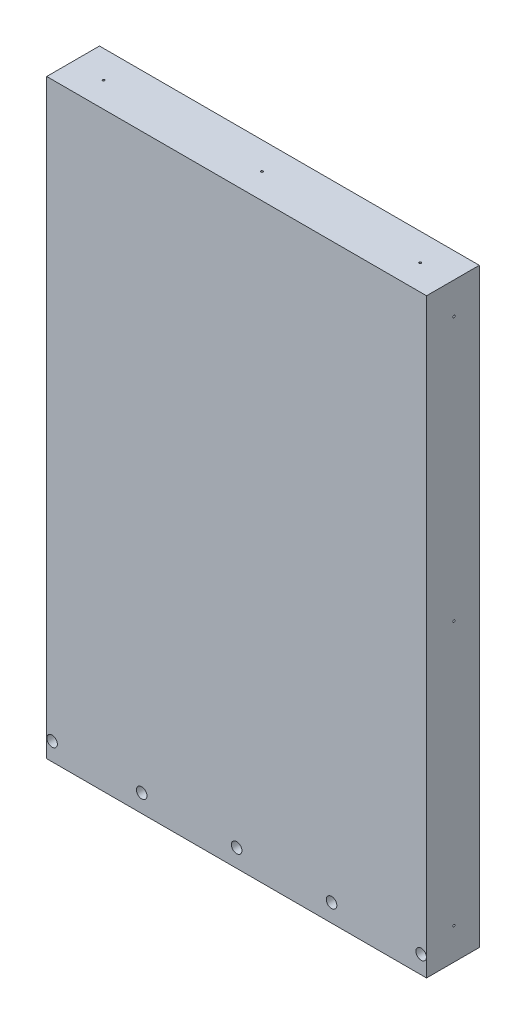
ISO-10303-21;
HEADER;
FILE_DESCRIPTION(('STEP AP214'),'2;1');
FILE_NAME('part.step','',(''),(''),'','','');
FILE_SCHEMA(('AUTOMOTIVE_DESIGN { 1 0 10303 214 1 1 1 1 }'));
ENDSEC;
DATA;
#1=APPLICATION_CONTEXT('core data for automotive mechanical design processes');
#2=APPLICATION_PROTOCOL_DEFINITION('international standard','automotive_design',2000,#1);
#3=PRODUCT_CONTEXT('',#1,'mechanical');
#4=PRODUCT('Part','Part','',(#3));
#5=PRODUCT_RELATED_PRODUCT_CATEGORY('part','',(#4));
#6=PRODUCT_DEFINITION_FORMATION('','',#4);
#7=PRODUCT_DEFINITION_CONTEXT('part definition',#1,'design');
#8=PRODUCT_DEFINITION('design','',#6,#7);
#9=PRODUCT_DEFINITION_SHAPE('','',#8);
#10=(LENGTH_UNIT() NAMED_UNIT(*) SI_UNIT(.MILLI.,.METRE.));
#11=(NAMED_UNIT(*) PLANE_ANGLE_UNIT() SI_UNIT($,.RADIAN.));
#12=(NAMED_UNIT(*) SI_UNIT($,.STERADIAN.) SOLID_ANGLE_UNIT());
#13=UNCERTAINTY_MEASURE_WITH_UNIT(LENGTH_MEASURE(1.E-05),#10,'distance_accuracy_value','');
#14=(GEOMETRIC_REPRESENTATION_CONTEXT(3) GLOBAL_UNCERTAINTY_ASSIGNED_CONTEXT((#13)) GLOBAL_UNIT_ASSIGNED_CONTEXT((#10,
#11,#12)) REPRESENTATION_CONTEXT('',''));
#15=CARTESIAN_POINT('',(0.,0.,0.));
#16=DIRECTION('',(0.,0.,1.));
#17=DIRECTION('',(1.,0.,0.));
#18=AXIS2_PLACEMENT_3D('',#15,#16,#17);
#19=CARTESIAN_POINT('',(0.,0.,25.));
#20=DIRECTION('',(0.,0.,-1.));
#21=DIRECTION('',(-1.,0.,0.));
#22=AXIS2_PLACEMENT_3D('',#19,#20,#21);
#23=PLANE('',#22);
#24=DIRECTION('',(0.,-1.,0.));
#25=VECTOR('',#24,1.);
#26=CARTESIAN_POINT('',(0.,0.,25.));
#27=LINE('',#26,#25);
#28=CARTESIAN_POINT('',(0.,280.,25.));
#29=VERTEX_POINT('',#28);
#30=CARTESIAN_POINT('',(0.,0.,25.));
#31=VERTEX_POINT('',#30);
#32=EDGE_CURVE('E229',#29,#31,#27,.T.);
#33=ORIENTED_EDGE('',*,*,#32,.T.);
#34=DIRECTION('',(1.,0.,0.));
#35=VECTOR('',#34,1.);
#36=CARTESIAN_POINT('',(0.,0.,25.));
#37=LINE('',#36,#35);
#38=CARTESIAN_POINT('',(180.,0.,25.));
#39=VERTEX_POINT('',#38);
#40=EDGE_CURVE('E86',#31,#39,#37,.T.);
#41=ORIENTED_EDGE('',*,*,#40,.T.);
#42=DIRECTION('',(0.,1.,0.));
#43=VECTOR('',#42,1.);
#44=CARTESIAN_POINT('',(180.,0.,25.));
#45=LINE('',#44,#43);
#46=CARTESIAN_POINT('',(180.,280.,25.));
#47=VERTEX_POINT('',#46);
#48=EDGE_CURVE('E232',#39,#47,#45,.T.);
#49=ORIENTED_EDGE('',*,*,#48,.T.);
#50=DIRECTION('',(-1.,0.,0.));
#51=VECTOR('',#50,1.);
#52=CARTESIAN_POINT('',(0.,280.,25.));
#53=LINE('',#52,#51);
#54=EDGE_CURVE('E55',#47,#29,#53,.T.);
#55=ORIENTED_EDGE('',*,*,#54,.T.);
#56=EDGE_LOOP('',(#33,#41,#49,#55));
#57=FACE_BOUND('',#56,.T.);
#58=CARTESIAN_POINT('',(2.55,8.5,25.));
#59=DIRECTION('',(0.,0.,1.));
#60=DIRECTION('',(1.,0.,0.));
#61=AXIS2_PLACEMENT_3D('',#58,#59,#60);
#62=CIRCLE('',#61,2.5);
#63=CARTESIAN_POINT('',(5.05,8.5,25.));
#64=VERTEX_POINT('',#63);
#65=EDGE_CURVE('E223',#64,#64,#62,.T.);
#66=ORIENTED_EDGE('',*,*,#65,.F.);
#67=EDGE_LOOP('',(#66));
#68=FACE_BOUND('',#67,.T.);
#69=CARTESIAN_POINT('',(45.,8.5,25.));
#70=DIRECTION('',(0.,0.,1.));
#71=DIRECTION('',(1.,0.,0.));
#72=AXIS2_PLACEMENT_3D('',#69,#70,#71);
#73=CIRCLE('',#72,2.5);
#74=CARTESIAN_POINT('',(47.5,8.5,25.));
#75=VERTEX_POINT('',#74);
#76=EDGE_CURVE('E217',#75,#75,#73,.T.);
#77=ORIENTED_EDGE('',*,*,#76,.F.);
#78=EDGE_LOOP('',(#77));
#79=FACE_BOUND('',#78,.T.);
#80=CARTESIAN_POINT('',(90.,8.5,25.));
#81=DIRECTION('',(0.,0.,1.));
#82=DIRECTION('',(1.,0.,0.));
#83=AXIS2_PLACEMENT_3D('',#80,#81,#82);
#84=CIRCLE('',#83,2.5);
#85=CARTESIAN_POINT('',(92.5,8.5,25.));
#86=VERTEX_POINT('',#85);
#87=EDGE_CURVE('E211',#86,#86,#84,.T.);
#88=ORIENTED_EDGE('',*,*,#87,.F.);
#89=EDGE_LOOP('',(#88));
#90=FACE_BOUND('',#89,.T.);
#91=CARTESIAN_POINT('',(135.,8.5,25.));
#92=DIRECTION('',(0.,0.,1.));
#93=DIRECTION('',(1.,0.,0.));
#94=AXIS2_PLACEMENT_3D('',#91,#92,#93);
#95=CIRCLE('',#94,2.5);
#96=CARTESIAN_POINT('',(137.5,8.5,25.));
#97=VERTEX_POINT('',#96);
#98=EDGE_CURVE('E205',#97,#97,#95,.T.);
#99=ORIENTED_EDGE('',*,*,#98,.F.);
#100=EDGE_LOOP('',(#99));
#101=FACE_BOUND('',#100,.T.);
#102=CARTESIAN_POINT('',(177.45,8.5,25.));
#103=DIRECTION('',(0.,0.,1.));
#104=DIRECTION('',(1.,0.,0.));
#105=AXIS2_PLACEMENT_3D('',#102,#103,#104);
#106=CIRCLE('',#105,2.5);
#107=CARTESIAN_POINT('',(179.95,8.5,25.));
#108=VERTEX_POINT('',#107);
#109=EDGE_CURVE('E199',#108,#108,#106,.T.);
#110=ORIENTED_EDGE('',*,*,#109,.F.);
#111=EDGE_LOOP('',(#110));
#112=FACE_BOUND('',#111,.T.);
#113=ADVANCED_FACE('F33',(#57,#68,#79,#90,#101,#112),#23,.F.);
#114=CARTESIAN_POINT('',(0.,0.,0.));
#115=DIRECTION('',(0.,0.,-1.));
#116=DIRECTION('',(-1.,0.,0.));
#117=AXIS2_PLACEMENT_3D('',#114,#115,#116);
#118=PLANE('',#117);
#119=CARTESIAN_POINT('',(135.,8.5,0.));
#120=DIRECTION('',(0.,0.,1.));
#121=DIRECTION('',(1.,0.,0.));
#122=AXIS2_PLACEMENT_3D('',#119,#120,#121);
#123=CIRCLE('',#122,2.5);
#124=CARTESIAN_POINT('',(137.5,8.5,0.));
#125=VERTEX_POINT('',#124);
#126=EDGE_CURVE('E202',#125,#125,#123,.T.);
#127=ORIENTED_EDGE('',*,*,#126,.T.);
#128=EDGE_LOOP('',(#127));
#129=FACE_BOUND('',#128,.T.);
#130=CARTESIAN_POINT('',(45.,8.5,0.));
#131=DIRECTION('',(0.,0.,1.));
#132=DIRECTION('',(1.,0.,0.));
#133=AXIS2_PLACEMENT_3D('',#130,#131,#132);
#134=CIRCLE('',#133,2.5);
#135=CARTESIAN_POINT('',(47.5,8.5,0.));
#136=VERTEX_POINT('',#135);
#137=EDGE_CURVE('E214',#136,#136,#134,.T.);
#138=ORIENTED_EDGE('',*,*,#137,.T.);
#139=EDGE_LOOP('',(#138));
#140=FACE_BOUND('',#139,.T.);
#141=DIRECTION('',(0.,-1.,0.));
#142=VECTOR('',#141,1.);
#143=CARTESIAN_POINT('',(0.,0.,0.));
#144=LINE('',#143,#142);
#145=CARTESIAN_POINT('',(0.,280.,0.));
#146=VERTEX_POINT('',#145);
#147=CARTESIAN_POINT('',(0.,0.,0.));
#148=VERTEX_POINT('',#147);
#149=EDGE_CURVE('E226',#146,#148,#144,.T.);
#150=ORIENTED_EDGE('',*,*,#149,.F.);
#151=DIRECTION('',(-1.,0.,0.));
#152=VECTOR('',#151,1.);
#153=CARTESIAN_POINT('',(0.,280.,0.));
#154=LINE('',#153,#152);
#155=CARTESIAN_POINT('',(180.,280.,0.));
#156=VERTEX_POINT('',#155);
#157=EDGE_CURVE('E79',#156,#146,#154,.T.);
#158=ORIENTED_EDGE('',*,*,#157,.F.);
#159=DIRECTION('',(0.,1.,0.));
#160=VECTOR('',#159,1.);
#161=CARTESIAN_POINT('',(180.,0.,0.));
#162=LINE('',#161,#160);
#163=CARTESIAN_POINT('',(180.,0.,0.));
#164=VERTEX_POINT('',#163);
#165=EDGE_CURVE('E73',#164,#156,#162,.T.);
#166=ORIENTED_EDGE('',*,*,#165,.F.);
#167=DIRECTION('',(1.,0.,0.));
#168=VECTOR('',#167,1.);
#169=CARTESIAN_POINT('',(0.,0.,0.));
#170=LINE('',#169,#168);
#171=EDGE_CURVE('E238',#148,#164,#170,.T.);
#172=ORIENTED_EDGE('',*,*,#171,.F.);
#173=EDGE_LOOP('',(#150,#158,#166,#172));
#174=FACE_BOUND('',#173,.T.);
#175=CARTESIAN_POINT('',(2.55,8.5,0.));
#176=DIRECTION('',(0.,0.,1.));
#177=DIRECTION('',(1.,0.,0.));
#178=AXIS2_PLACEMENT_3D('',#175,#176,#177);
#179=CIRCLE('',#178,2.5);
#180=CARTESIAN_POINT('',(5.05,8.5,0.));
#181=VERTEX_POINT('',#180);
#182=EDGE_CURVE('E220',#181,#181,#179,.T.);
#183=ORIENTED_EDGE('',*,*,#182,.T.);
#184=EDGE_LOOP('',(#183));
#185=FACE_BOUND('',#184,.T.);
#186=CARTESIAN_POINT('',(90.,8.5,0.));
#187=DIRECTION('',(0.,0.,1.));
#188=DIRECTION('',(1.,0.,0.));
#189=AXIS2_PLACEMENT_3D('',#186,#187,#188);
#190=CIRCLE('',#189,2.5);
#191=CARTESIAN_POINT('',(92.5,8.5,0.));
#192=VERTEX_POINT('',#191);
#193=EDGE_CURVE('E208',#192,#192,#190,.T.);
#194=ORIENTED_EDGE('',*,*,#193,.T.);
#195=EDGE_LOOP('',(#194));
#196=FACE_BOUND('',#195,.T.);
#197=CARTESIAN_POINT('',(177.45,8.5,0.));
#198=DIRECTION('',(0.,0.,1.));
#199=DIRECTION('',(1.,0.,0.));
#200=AXIS2_PLACEMENT_3D('',#197,#198,#199);
#201=CIRCLE('',#200,2.5);
#202=CARTESIAN_POINT('',(179.95,8.5,0.));
#203=VERTEX_POINT('',#202);
#204=EDGE_CURVE('E198',#203,#203,#201,.T.);
#205=ORIENTED_EDGE('',*,*,#204,.T.);
#206=EDGE_LOOP('',(#205));
#207=FACE_BOUND('',#206,.T.);
#208=ADVANCED_FACE('F249',(#129,#140,#174,#185,#196,#207),#118,.T.);
#209=CARTESIAN_POINT('',(0.,0.,25.));
#210=DIRECTION('',(1.,0.,0.));
#211=DIRECTION('',(0.,0.,-1.));
#212=AXIS2_PLACEMENT_3D('',#209,#210,#211);
#213=PLANE('',#212);
#214=CARTESIAN_POINT('',(0.,265.,12.));
#215=DIRECTION('',(-1.,0.,0.));
#216=DIRECTION('',(0.,0.,1.));
#217=AXIS2_PLACEMENT_3D('',#214,#215,#216);
#218=CIRCLE('',#217,0.5);
#219=CARTESIAN_POINT('',(0.,265.,12.5));
#220=VERTEX_POINT('',#219);
#221=EDGE_CURVE('E180',#220,#220,#218,.T.);
#222=ORIENTED_EDGE('',*,*,#221,.F.);
#223=EDGE_LOOP('',(#222));
#224=FACE_BOUND('',#223,.T.);
#225=CARTESIAN_POINT('',(0.,140.,12.));
#226=DIRECTION('',(-1.,0.,0.));
#227=DIRECTION('',(0.,0.,1.));
#228=AXIS2_PLACEMENT_3D('',#225,#226,#227);
#229=CIRCLE('',#228,0.5);
#230=CARTESIAN_POINT('',(0.,140.,12.5));
#231=VERTEX_POINT('',#230);
#232=EDGE_CURVE('E186',#231,#231,#229,.T.);
#233=ORIENTED_EDGE('',*,*,#232,.F.);
#234=EDGE_LOOP('',(#233));
#235=FACE_BOUND('',#234,.T.);
#236=CARTESIAN_POINT('',(0.,15.,12.));
#237=DIRECTION('',(-1.,0.,0.));
#238=DIRECTION('',(0.,0.,1.));
#239=AXIS2_PLACEMENT_3D('',#236,#237,#238);
#240=CIRCLE('',#239,0.49999999999999);
#241=CARTESIAN_POINT('',(0.,15.,12.5));
#242=VERTEX_POINT('',#241);
#243=EDGE_CURVE('E192',#242,#242,#240,.T.);
#244=ORIENTED_EDGE('',*,*,#243,.F.);
#245=EDGE_LOOP('',(#244));
#246=FACE_BOUND('',#245,.T.);
#247=ORIENTED_EDGE('',*,*,#149,.T.);
#248=DIRECTION('',(0.,0.,-1.));
#249=VECTOR('',#248,1.);
#250=CARTESIAN_POINT('',(0.,0.,25.));
#251=LINE('',#250,#249);
#252=EDGE_CURVE('E11',#31,#148,#251,.T.);
#253=ORIENTED_EDGE('',*,*,#252,.F.);
#254=ORIENTED_EDGE('',*,*,#32,.F.);
#255=DIRECTION('',(0.,0.,-1.));
#256=VECTOR('',#255,1.);
#257=CARTESIAN_POINT('',(0.,280.,25.));
#258=LINE('',#257,#256);
#259=EDGE_CURVE('E235',#29,#146,#258,.T.);
#260=ORIENTED_EDGE('',*,*,#259,.T.);
#261=EDGE_LOOP('',(#247,#253,#254,#260));
#262=FACE_BOUND('',#261,.T.);
#263=ADVANCED_FACE('F35',(#224,#235,#246,#262),#213,.F.);
#264=CARTESIAN_POINT('',(0.,0.,25.));
#265=DIRECTION('',(0.,1.,0.));
#266=DIRECTION('',(0.,0.,1.));
#267=AXIS2_PLACEMENT_3D('',#264,#265,#266);
#268=PLANE('',#267);
#269=CARTESIAN_POINT('',(15.,0.,13.));
#270=DIRECTION('',(0.,-1.,0.));
#271=DIRECTION('',(0.,0.,-1.));
#272=AXIS2_PLACEMENT_3D('',#269,#270,#271);
#273=CIRCLE('',#272,0.49999999999999);
#274=CARTESIAN_POINT('',(15.,0.,12.5));
#275=VERTEX_POINT('',#274);
#276=EDGE_CURVE('E147',#275,#275,#273,.T.);
#277=ORIENTED_EDGE('',*,*,#276,.F.);
#278=EDGE_LOOP('',(#277));
#279=FACE_BOUND('',#278,.T.);
#280=CARTESIAN_POINT('',(90.,0.,13.));
#281=DIRECTION('',(0.,-1.,0.));
#282=DIRECTION('',(0.,0.,-1.));
#283=AXIS2_PLACEMENT_3D('',#280,#281,#282);
#284=CIRCLE('',#283,0.499999999999987);
#285=CARTESIAN_POINT('',(90.,0.,12.5));
#286=VERTEX_POINT('',#285);
#287=EDGE_CURVE('E153',#286,#286,#284,.T.);
#288=ORIENTED_EDGE('',*,*,#287,.F.);
#289=EDGE_LOOP('',(#288));
#290=FACE_BOUND('',#289,.T.);
#291=CARTESIAN_POINT('',(165.,0.,13.));
#292=DIRECTION('',(0.,-1.,0.));
#293=DIRECTION('',(0.,0.,-1.));
#294=AXIS2_PLACEMENT_3D('',#291,#292,#293);
#295=CIRCLE('',#294,0.5);
#296=CARTESIAN_POINT('',(165.,0.,12.5));
#297=VERTEX_POINT('',#296);
#298=EDGE_CURVE('E156',#297,#297,#295,.T.);
#299=ORIENTED_EDGE('',*,*,#298,.F.);
#300=EDGE_LOOP('',(#299));
#301=FACE_BOUND('',#300,.T.);
#302=ORIENTED_EDGE('',*,*,#171,.T.);
#303=DIRECTION('',(0.,0.,-1.));
#304=VECTOR('',#303,1.);
#305=CARTESIAN_POINT('',(180.,0.,25.));
#306=LINE('',#305,#304);
#307=EDGE_CURVE('E47',#39,#164,#306,.T.);
#308=ORIENTED_EDGE('',*,*,#307,.F.);
#309=ORIENTED_EDGE('',*,*,#40,.F.);
#310=ORIENTED_EDGE('',*,*,#252,.T.);
#311=EDGE_LOOP('',(#302,#308,#309,#310));
#312=FACE_BOUND('',#311,.T.);
#313=ADVANCED_FACE('F268',(#279,#290,#301,#312),#268,.F.);
#314=CARTESIAN_POINT('',(180.,0.,25.));
#315=DIRECTION('',(-1.,0.,0.));
#316=DIRECTION('',(0.,0.,1.));
#317=AXIS2_PLACEMENT_3D('',#314,#315,#316);
#318=PLANE('',#317);
#319=CARTESIAN_POINT('',(180.,15.,12.));
#320=DIRECTION('',(1.,0.,0.));
#321=DIRECTION('',(0.,0.,-1.));
#322=AXIS2_PLACEMENT_3D('',#319,#320,#321);
#323=CIRCLE('',#322,0.49999999999999);
#324=CARTESIAN_POINT('',(180.,15.,11.5));
#325=VERTEX_POINT('',#324);
#326=EDGE_CURVE('E162',#325,#325,#323,.T.);
#327=ORIENTED_EDGE('',*,*,#326,.F.);
#328=EDGE_LOOP('',(#327));
#329=FACE_BOUND('',#328,.T.);
#330=CARTESIAN_POINT('',(180.,140.,12.));
#331=DIRECTION('',(1.,0.,0.));
#332=DIRECTION('',(0.,0.,-1.));
#333=AXIS2_PLACEMENT_3D('',#330,#331,#332);
#334=CIRCLE('',#333,0.5);
#335=CARTESIAN_POINT('',(180.,140.,11.5));
#336=VERTEX_POINT('',#335);
#337=EDGE_CURVE('E168',#336,#336,#334,.T.);
#338=ORIENTED_EDGE('',*,*,#337,.F.);
#339=EDGE_LOOP('',(#338));
#340=FACE_BOUND('',#339,.T.);
#341=CARTESIAN_POINT('',(180.,265.,12.));
#342=DIRECTION('',(1.,0.,0.));
#343=DIRECTION('',(0.,0.,-1.));
#344=AXIS2_PLACEMENT_3D('',#341,#342,#343);
#345=CIRCLE('',#344,0.5);
#346=CARTESIAN_POINT('',(180.,265.,11.5));
#347=VERTEX_POINT('',#346);
#348=EDGE_CURVE('E174',#347,#347,#345,.T.);
#349=ORIENTED_EDGE('',*,*,#348,.F.);
#350=EDGE_LOOP('',(#349));
#351=FACE_BOUND('',#350,.T.);
#352=ORIENTED_EDGE('',*,*,#165,.T.);
#353=DIRECTION('',(0.,0.,-1.));
#354=VECTOR('',#353,1.);
#355=CARTESIAN_POINT('',(180.,280.,25.));
#356=LINE('',#355,#354);
#357=EDGE_CURVE('E243',#47,#156,#356,.T.);
#358=ORIENTED_EDGE('',*,*,#357,.F.);
#359=ORIENTED_EDGE('',*,*,#48,.F.);
#360=ORIENTED_EDGE('',*,*,#307,.T.);
#361=EDGE_LOOP('',(#352,#358,#359,#360));
#362=FACE_BOUND('',#361,.T.);
#363=ADVANCED_FACE('F246',(#329,#340,#351,#362),#318,.F.);
#364=CARTESIAN_POINT('',(0.,280.,25.));
#365=DIRECTION('',(0.,-1.,0.));
#366=DIRECTION('',(0.,0.,-1.));
#367=AXIS2_PLACEMENT_3D('',#364,#365,#366);
#368=PLANE('',#367);
#369=CARTESIAN_POINT('',(15.,280.,13.));
#370=DIRECTION('',(0.,1.,0.));
#371=DIRECTION('',(0.,0.,1.));
#372=AXIS2_PLACEMENT_3D('',#369,#370,#371);
#373=CIRCLE('',#372,0.49999999999999);
#374=CARTESIAN_POINT('',(15.,280.,13.5));
#375=VERTEX_POINT('',#374);
#376=EDGE_CURVE('E131',#375,#375,#373,.T.);
#377=ORIENTED_EDGE('',*,*,#376,.F.);
#378=EDGE_LOOP('',(#377));
#379=FACE_BOUND('',#378,.T.);
#380=CARTESIAN_POINT('',(90.,280.,13.));
#381=DIRECTION('',(0.,1.,0.));
#382=DIRECTION('',(0.,0.,1.));
#383=AXIS2_PLACEMENT_3D('',#380,#381,#382);
#384=CIRCLE('',#383,0.499999999999987);
#385=CARTESIAN_POINT('',(90.,280.,13.5));
#386=VERTEX_POINT('',#385);
#387=EDGE_CURVE('E130',#386,#386,#384,.T.);
#388=ORIENTED_EDGE('',*,*,#387,.F.);
#389=EDGE_LOOP('',(#388));
#390=FACE_BOUND('',#389,.T.);
#391=CARTESIAN_POINT('',(165.,280.,13.));
#392=DIRECTION('',(0.,1.,0.));
#393=DIRECTION('',(0.,0.,1.));
#394=AXIS2_PLACEMENT_3D('',#391,#392,#393);
#395=CIRCLE('',#394,0.5);
#396=CARTESIAN_POINT('',(165.,280.,13.5));
#397=VERTEX_POINT('',#396);
#398=EDGE_CURVE('E141',#397,#397,#395,.T.);
#399=ORIENTED_EDGE('',*,*,#398,.F.);
#400=EDGE_LOOP('',(#399));
#401=FACE_BOUND('',#400,.T.);
#402=ORIENTED_EDGE('',*,*,#157,.T.);
#403=ORIENTED_EDGE('',*,*,#259,.F.);
#404=ORIENTED_EDGE('',*,*,#54,.F.);
#405=ORIENTED_EDGE('',*,*,#357,.T.);
#406=EDGE_LOOP('',(#402,#403,#404,#405));
#407=FACE_BOUND('',#406,.T.);
#408=ADVANCED_FACE('F254',(#379,#390,#401,#407),#368,.F.);
#409=CARTESIAN_POINT('',(2.55,8.5,25.));
#410=DIRECTION('',(0.,0.,-1.));
#411=DIRECTION('',(-1.,0.,0.));
#412=AXIS2_PLACEMENT_3D('',#409,#410,#411);
#413=CYLINDRICAL_SURFACE('',#412,2.5);
#414=ORIENTED_EDGE('',*,*,#65,.T.);
#415=EDGE_LOOP('',(#414));
#416=FACE_BOUND('',#415,.T.);
#417=ORIENTED_EDGE('',*,*,#182,.F.);
#418=EDGE_LOOP('',(#417));
#419=FACE_BOUND('',#418,.T.);
#420=ADVANCED_FACE('F256',(#416,#419),#413,.F.);
#421=CARTESIAN_POINT('',(45.,8.5,25.));
#422=DIRECTION('',(0.,0.,-1.));
#423=DIRECTION('',(-1.,0.,0.));
#424=AXIS2_PLACEMENT_3D('',#421,#422,#423);
#425=CYLINDRICAL_SURFACE('',#424,2.5);
#426=ORIENTED_EDGE('',*,*,#76,.T.);
#427=EDGE_LOOP('',(#426));
#428=FACE_BOUND('',#427,.T.);
#429=ORIENTED_EDGE('',*,*,#137,.F.);
#430=EDGE_LOOP('',(#429));
#431=FACE_BOUND('',#430,.T.);
#432=ADVANCED_FACE('F264',(#428,#431),#425,.F.);
#433=CARTESIAN_POINT('',(90.,8.5,25.));
#434=DIRECTION('',(0.,0.,-1.));
#435=DIRECTION('',(-1.,0.,0.));
#436=AXIS2_PLACEMENT_3D('',#433,#434,#435);
#437=CYLINDRICAL_SURFACE('',#436,2.5);
#438=CARTESIAN_POINT('',(90.,6.00000000000001,12.5));
#439=CARTESIAN_POINT('',(89.9722115466036,6.00000051209565,12.5000010222492));
#440=CARTESIAN_POINT('',(89.9444101698992,6.00046807410885,12.5023244214838));
#441=CARTESIAN_POINT('',(89.8895932461555,6.00228817188385,12.5115492500576));
#442=CARTESIAN_POINT('',(89.8625783412293,6.00364141069908,12.5184543164008));
#443=CARTESIAN_POINT('',(89.8101348473683,6.00708175360857,12.5366206368104));
#444=CARTESIAN_POINT('',(89.7847047660334,6.00916815461642,12.5478777184224));
#445=CARTESIAN_POINT('',(89.7360960055679,6.01384800982343,12.5744161237557));
#446=CARTESIAN_POINT('',(89.7129171924621,6.01644143382147,12.5896972078036));
#447=CARTESIAN_POINT('',(89.6691532613426,6.02188917335016,12.6240692471457));
#448=CARTESIAN_POINT('',(89.6486030244207,6.02474627247827,12.6432041776956));
#449=CARTESIAN_POINT('',(89.610981621696,6.03037909773707,12.6846462081959));
#450=CARTESIAN_POINT('',(89.5939107276148,6.03315481749789,12.7069535556676));
#451=CARTESIAN_POINT('',(89.5635841233262,6.03833779093693,12.7543580965059));
#452=CARTESIAN_POINT('',(89.550364530567,6.04074146317528,12.7794788218982));
#453=CARTESIAN_POINT('',(89.5283471667098,6.04486865970792,12.831640909502));
#454=CARTESIAN_POINT('',(89.5195489587814,6.0465922511902,12.8586820816732));
#455=CARTESIAN_POINT('',(89.5067373500576,6.04913597373899,12.913542181954));
#456=CARTESIAN_POINT('',(89.5026627510206,6.04996764946407,12.9413462720711));
#457=CARTESIAN_POINT('',(89.4992239361369,6.05066812469687,12.9972549106822));
#458=CARTESIAN_POINT('',(89.4998592386432,6.0505370226608,13.0253594281601));
#459=CARTESIAN_POINT('',(89.5057727134491,6.04933724425909,13.0806233940105));
#460=CARTESIAN_POINT('',(89.510980729878,6.04828273570619,13.1077907028137));
#461=CARTESIAN_POINT('',(89.5257810576885,6.0453772692,13.1608580383315));
#462=CARTESIAN_POINT('',(89.5353735784497,6.04352627321112,13.1867580044595));
#463=CARTESIAN_POINT('',(89.5587376081626,6.03922190749797,13.2367576308518));
#464=CARTESIAN_POINT('',(89.5725369243839,6.03676455093149,13.2608439397846));
#465=CARTESIAN_POINT('',(89.6039032127136,6.0315269061347,13.3063854249864));
#466=CARTESIAN_POINT('',(89.6214706178216,6.02874658080818,13.3278402984256));
#467=CARTESIAN_POINT('',(89.6602500327197,6.0231148937927,13.3679147012285));
#468=CARTESIAN_POINT('',(89.6815219193938,6.02026315394548,13.3864762839296));
#469=CARTESIAN_POINT('',(89.726907487969,6.01485575642797,13.4197769231506));
#470=CARTESIAN_POINT('',(89.7510212063103,6.01230010255514,13.4345159306468));
#471=CARTESIAN_POINT('',(89.8014703065605,6.00776654919557,13.459763754613));
#472=CARTESIAN_POINT('',(89.8278090902073,6.00578955575865,13.4702659468223));
#473=CARTESIAN_POINT('',(89.8819255117756,6.00264295506072,13.4866802370193));
#474=CARTESIAN_POINT('',(89.9097029749637,6.00147324999735,13.4925928910368));
#475=CARTESIAN_POINT('',(89.9654102971864,6.00008664066567,13.4995782268971));
#476=CARTESIAN_POINT('',(89.9933298358372,5.99985412673766,13.5007302097701));
#477=CARTESIAN_POINT('',(90.0489624670963,6.00032474034949,13.4983750705289));
#478=CARTESIAN_POINT('',(90.0766755712218,6.00102781529277,13.4948682103237));
#479=CARTESIAN_POINT('',(90.1308528299732,6.00328083995992,13.483360813228));
#480=CARTESIAN_POINT('',(90.1573259741699,6.00482311797897,13.4754009657511));
#481=CARTESIAN_POINT('',(90.2085618137498,6.00858223969484,13.4552580086721));
#482=CARTESIAN_POINT('',(90.2333243808187,6.01079913392887,13.4430745826616));
#483=CARTESIAN_POINT('',(90.2807705868431,6.01570044233353,13.4146587546743));
#484=CARTESIAN_POINT('',(90.3034250633761,6.01839024781474,13.3983786094805));
#485=CARTESIAN_POINT('',(90.3457090095596,6.02392632585059,13.3622954043964));
#486=CARTESIAN_POINT('',(90.3653381544653,6.02677261515806,13.3424919668001));
#487=CARTESIAN_POINT('',(90.401320295387,6.03235348221517,13.2995633240544));
#488=CARTESIAN_POINT('',(90.4176188512243,6.03508569883348,13.2763921278893));
#489=CARTESIAN_POINT('',(90.4460927100256,6.04007904101903,13.2275943193217));
#490=CARTESIAN_POINT('',(90.4582681779614,6.04234018543328,13.2019678052132));
#491=CARTESIAN_POINT('',(90.4780759207909,6.04611629707808,13.1491158769252));
#492=CARTESIAN_POINT('',(90.4857317498955,6.04763512563906,13.1218995793949));
#493=CARTESIAN_POINT('',(90.4963543258136,6.04976281603987,13.0665332732546));
#494=CARTESIAN_POINT('',(90.4993216841125,6.05037179654444,13.0383833868953));
#495=CARTESIAN_POINT('',(90.5004604554337,6.0506042518431,12.9824955677279));
#496=CARTESIAN_POINT('',(90.4987178940354,6.05024540405349,12.9547594255365));
#497=CARTESIAN_POINT('',(90.49067615205,6.04862213257693,12.8999841750475));
#498=CARTESIAN_POINT('',(90.4843770080646,6.04735771616415,12.8729450611526));
#499=CARTESIAN_POINT('',(90.4674392842494,6.04407367890421,12.8203861443797));
#500=CARTESIAN_POINT('',(90.4568112533586,6.04205589490585,12.7948628197488));
#501=CARTESIAN_POINT('',(90.4315273223008,6.03749142512915,12.7459481396328));
#502=CARTESIAN_POINT('',(90.4168710843874,6.03494469500553,12.7225569631375));
#503=CARTESIAN_POINT('',(90.3836529573932,6.02955519738387,12.6781422139249));
#504=CARTESIAN_POINT('',(90.3650289436176,6.0267081354515,12.6571656173662));
#505=CARTESIAN_POINT('',(90.3245321845065,6.02106959064023,12.6186068972354));
#506=CARTESIAN_POINT('',(90.3026586935766,6.01827812068408,12.6010255548414));
#507=CARTESIAN_POINT('',(90.2560088145441,6.01303083806015,12.5695826780268));
#508=CARTESIAN_POINT('',(90.2312044422149,6.01057884390377,12.55576199836));
#509=CARTESIAN_POINT('',(90.1795831804703,6.006324374575,12.5325069387017));
#510=CARTESIAN_POINT('',(90.1527681304315,6.00452131430692,12.5230686052338));
#511=CARTESIAN_POINT('',(90.1049107444619,6.00211813702315,12.5106740259777));
#512=CARTESIAN_POINT('',(90.0841408320069,6.00132848420775,12.5066784031461));
#513=CARTESIAN_POINT('',(90.042249762605,6.00026922930054,12.5013410438208));
#514=CARTESIAN_POINT('',(90.0211286168743,5.99999961063423,12.4999992227451));
#515=CARTESIAN_POINT('',(90.,6.00000000000001,12.5));
#516=B_SPLINE_CURVE_WITH_KNOTS('',3,(#438,#439,#440,#441,#442,#443,#444,#445,#446,#447,#448,
#449,#450,#451,#452,#453,#454,#455,#456,#457,#458,#459,#460,#461,#462,#463,#464,#465,#466,#467,
#468,#469,#470,#471,#472,#473,#474,#475,#476,#477,#478,#479,#480,#481,#482,#483,#484,#485,#486,
#487,#488,#489,#490,#491,#492,#493,#494,#495,#496,#497,#498,#499,#500,#501,#502,#503,#504,#505,
#506,#507,#508,#509,#510,#511,#512,#513,#514,#515),.UNSPECIFIED.,.T.,.F.,(4,2,2,2,2,2,2,2,2,2,2,
2,2,2,2,2,2,2,2,2,2,2,2,2,2,2,2,2,2,2,2,2,2,2,2,2,2,2,4),(0.,0.0832880653306243,
0.166642325345654,0.249916867625152,0.333186451115411,0.417466335056074,0.501752798373659,
0.586805975029592,0.671850746825962,0.755780925517912,0.839702521406101,0.922358635031363,
1.00501869626862,1.08823745101794,1.17146577374832,1.25619126245671,1.34091783769906,
1.42577637427008,1.51062462849014,1.59405367838126,1.67747803828927,1.76015226975356,
1.84283269608007,1.92652533016675,2.01022694172959,2.09520314289607,2.18017594361727,
2.26470190516355,2.349216841652,2.43219861283843,2.51517971746297,2.59795980626548,
2.68074683790926,2.76494038119563,2.84915327266457,2.9342474833781,3.01926477758751,
3.08259387644938,3.14592095685489),.UNSPECIFIED.);
#517=CARTESIAN_POINT('',(90.,6.00000000000001,12.5));
#518=VERTEX_POINT('',#517);
#519=EDGE_CURVE('E37',#518,#518,#516,.T.);
#520=ORIENTED_EDGE('',*,*,#519,.F.);
#521=EDGE_LOOP('',(#520));
#522=FACE_BOUND('',#521,.T.);
#523=ORIENTED_EDGE('',*,*,#87,.T.);
#524=EDGE_LOOP('',(#523));
#525=FACE_BOUND('',#524,.T.);
#526=ORIENTED_EDGE('',*,*,#193,.F.);
#527=EDGE_LOOP('',(#526));
#528=FACE_BOUND('',#527,.T.);
#529=ADVANCED_FACE('F283',(#522,#525,#528),#437,.F.);
#530=CARTESIAN_POINT('',(135.,8.5,25.));
#531=DIRECTION('',(0.,0.,-1.));
#532=DIRECTION('',(-1.,0.,0.));
#533=AXIS2_PLACEMENT_3D('',#530,#531,#532);
#534=CYLINDRICAL_SURFACE('',#533,2.5);
#535=ORIENTED_EDGE('',*,*,#98,.T.);
#536=EDGE_LOOP('',(#535));
#537=FACE_BOUND('',#536,.T.);
#538=ORIENTED_EDGE('',*,*,#126,.F.);
#539=EDGE_LOOP('',(#538));
#540=FACE_BOUND('',#539,.T.);
#541=ADVANCED_FACE('F288',(#537,#540),#534,.F.);
#542=CARTESIAN_POINT('',(177.45,8.5,25.));
#543=DIRECTION('',(0.,0.,-1.));
#544=DIRECTION('',(-1.,0.,0.));
#545=AXIS2_PLACEMENT_3D('',#542,#543,#544);
#546=CYLINDRICAL_SURFACE('',#545,2.5);
#547=ORIENTED_EDGE('',*,*,#109,.T.);
#548=EDGE_LOOP('',(#547));
#549=FACE_BOUND('',#548,.T.);
#550=ORIENTED_EDGE('',*,*,#204,.F.);
#551=EDGE_LOOP('',(#550));
#552=FACE_BOUND('',#551,.T.);
#553=ADVANCED_FACE('F292',(#549,#552),#546,.F.);
#554=CARTESIAN_POINT('',(9.99999999999999,15.,12.));
#555=DIRECTION('',(-1.,0.,0.));
#556=DIRECTION('',(0.,0.,1.));
#557=AXIS2_PLACEMENT_3D('',#554,#555,#556);
#558=CONICAL_SURFACE('',#557,0.499999999999988,1.02974425867664);
#559=CARTESIAN_POINT('',(10.3004303095138,15.,12.));
#560=VERTEX_POINT('',#559);
#561=VERTEX_LOOP('',#560);
#562=FACE_BOUND('',#561,.T.);
#563=CARTESIAN_POINT('',(9.99999999999999,15.,12.));
#564=DIRECTION('',(-1.,0.,0.));
#565=DIRECTION('',(0.,0.,1.));
#566=AXIS2_PLACEMENT_3D('',#563,#564,#565);
#567=CIRCLE('',#566,0.499999999999988);
#568=CARTESIAN_POINT('',(9.99999999999999,15.,12.5));
#569=VERTEX_POINT('',#568);
#570=EDGE_CURVE('E195',#569,#569,#567,.T.);
#571=ORIENTED_EDGE('',*,*,#570,.T.);
#572=EDGE_LOOP('',(#571));
#573=FACE_BOUND('',#572,.T.);
#574=ADVANCED_FACE('F296',(#562,#573),#558,.F.);
#575=CARTESIAN_POINT('',(0.,15.,12.));
#576=DIRECTION('',(-1.,0.,0.));
#577=DIRECTION('',(0.,0.,1.));
#578=AXIS2_PLACEMENT_3D('',#575,#576,#577);
#579=CYLINDRICAL_SURFACE('',#578,0.499999999999989);
#580=ORIENTED_EDGE('',*,*,#570,.F.);
#581=EDGE_LOOP('',(#580));
#582=FACE_BOUND('',#581,.T.);
#583=ORIENTED_EDGE('',*,*,#243,.T.);
#584=EDGE_LOOP('',(#583));
#585=FACE_BOUND('',#584,.T.);
#586=ADVANCED_FACE('F300',(#582,#585),#579,.F.);
#587=CARTESIAN_POINT('',(9.99999999999999,140.,12.));
#588=DIRECTION('',(-1.,0.,0.));
#589=DIRECTION('',(0.,0.,1.));
#590=AXIS2_PLACEMENT_3D('',#587,#588,#589);
#591=CONICAL_SURFACE('',#590,0.5,1.02974425867665);
#592=CARTESIAN_POINT('',(10.3004303095138,140.,12.));
#593=VERTEX_POINT('',#592);
#594=VERTEX_LOOP('',#593);
#595=FACE_BOUND('',#594,.T.);
#596=CARTESIAN_POINT('',(9.99999999999999,140.,12.));
#597=DIRECTION('',(-1.,0.,0.));
#598=DIRECTION('',(0.,0.,1.));
#599=AXIS2_PLACEMENT_3D('',#596,#597,#598);
#600=CIRCLE('',#599,0.5);
#601=CARTESIAN_POINT('',(9.99999999999999,140.,12.5));
#602=VERTEX_POINT('',#601);
#603=EDGE_CURVE('E189',#602,#602,#600,.T.);
#604=ORIENTED_EDGE('',*,*,#603,.T.);
#605=EDGE_LOOP('',(#604));
#606=FACE_BOUND('',#605,.T.);
#607=ADVANCED_FACE('F304',(#595,#606),#591,.F.);
#608=CARTESIAN_POINT('',(0.,140.,12.));
#609=DIRECTION('',(-1.,0.,0.));
#610=DIRECTION('',(0.,0.,1.));
#611=AXIS2_PLACEMENT_3D('',#608,#609,#610);
#612=CYLINDRICAL_SURFACE('',#611,0.5);
#613=ORIENTED_EDGE('',*,*,#603,.F.);
#614=EDGE_LOOP('',(#613));
#615=FACE_BOUND('',#614,.T.);
#616=ORIENTED_EDGE('',*,*,#232,.T.);
#617=EDGE_LOOP('',(#616));
#618=FACE_BOUND('',#617,.T.);
#619=ADVANCED_FACE('F308',(#615,#618),#612,.F.);
#620=CARTESIAN_POINT('',(9.99999999999999,265.,12.));
#621=DIRECTION('',(-1.,0.,0.));
#622=DIRECTION('',(0.,0.,1.));
#623=AXIS2_PLACEMENT_3D('',#620,#621,#622);
#624=CONICAL_SURFACE('',#623,0.5,1.02974425867665);
#625=CARTESIAN_POINT('',(10.3004303095138,265.,12.));
#626=VERTEX_POINT('',#625);
#627=VERTEX_LOOP('',#626);
#628=FACE_BOUND('',#627,.T.);
#629=CARTESIAN_POINT('',(9.99999999999999,265.,12.));
#630=DIRECTION('',(-1.,0.,0.));
#631=DIRECTION('',(0.,0.,1.));
#632=AXIS2_PLACEMENT_3D('',#629,#630,#631);
#633=CIRCLE('',#632,0.5);
#634=CARTESIAN_POINT('',(9.99999999999999,265.,12.5));
#635=VERTEX_POINT('',#634);
#636=EDGE_CURVE('E183',#635,#635,#633,.T.);
#637=ORIENTED_EDGE('',*,*,#636,.T.);
#638=EDGE_LOOP('',(#637));
#639=FACE_BOUND('',#638,.T.);
#640=ADVANCED_FACE('F312',(#628,#639),#624,.F.);
#641=CARTESIAN_POINT('',(0.,265.,12.));
#642=DIRECTION('',(-1.,0.,0.));
#643=DIRECTION('',(0.,0.,1.));
#644=AXIS2_PLACEMENT_3D('',#641,#642,#643);
#645=CYLINDRICAL_SURFACE('',#644,0.5);
#646=ORIENTED_EDGE('',*,*,#636,.F.);
#647=EDGE_LOOP('',(#646));
#648=FACE_BOUND('',#647,.T.);
#649=ORIENTED_EDGE('',*,*,#221,.T.);
#650=EDGE_LOOP('',(#649));
#651=FACE_BOUND('',#650,.T.);
#652=ADVANCED_FACE('F316',(#648,#651),#645,.F.);
#653=CARTESIAN_POINT('',(170.,265.,12.));
#654=DIRECTION('',(1.,0.,0.));
#655=DIRECTION('',(0.,0.,-1.));
#656=AXIS2_PLACEMENT_3D('',#653,#654,#655);
#657=CONICAL_SURFACE('',#656,0.5,1.02974425867668);
#658=CARTESIAN_POINT('',(169.699569690486,265.,12.));
#659=VERTEX_POINT('',#658);
#660=VERTEX_LOOP('',#659);
#661=FACE_BOUND('',#660,.T.);
#662=CARTESIAN_POINT('',(170.,265.,12.));
#663=DIRECTION('',(1.,0.,0.));
#664=DIRECTION('',(0.,0.,-1.));
#665=AXIS2_PLACEMENT_3D('',#662,#663,#664);
#666=CIRCLE('',#665,0.5);
#667=CARTESIAN_POINT('',(170.,265.,11.5));
#668=VERTEX_POINT('',#667);
#669=EDGE_CURVE('E177',#668,#668,#666,.T.);
#670=ORIENTED_EDGE('',*,*,#669,.T.);
#671=EDGE_LOOP('',(#670));
#672=FACE_BOUND('',#671,.T.);
#673=ADVANCED_FACE('F320',(#661,#672),#657,.F.);
#674=CARTESIAN_POINT('',(180.,265.,12.));
#675=DIRECTION('',(1.,0.,0.));
#676=DIRECTION('',(0.,0.,-1.));
#677=AXIS2_PLACEMENT_3D('',#674,#675,#676);
#678=CYLINDRICAL_SURFACE('',#677,0.5);
#679=ORIENTED_EDGE('',*,*,#669,.F.);
#680=EDGE_LOOP('',(#679));
#681=FACE_BOUND('',#680,.T.);
#682=ORIENTED_EDGE('',*,*,#348,.T.);
#683=EDGE_LOOP('',(#682));
#684=FACE_BOUND('',#683,.T.);
#685=ADVANCED_FACE('F324',(#681,#684),#678,.F.);
#686=CARTESIAN_POINT('',(170.,140.,12.));
#687=DIRECTION('',(1.,0.,0.));
#688=DIRECTION('',(0.,0.,-1.));
#689=AXIS2_PLACEMENT_3D('',#686,#687,#688);
#690=CONICAL_SURFACE('',#689,0.5,1.02974425867668);
#691=CARTESIAN_POINT('',(169.699569690486,140.,12.));
#692=VERTEX_POINT('',#691);
#693=VERTEX_LOOP('',#692);
#694=FACE_BOUND('',#693,.T.);
#695=CARTESIAN_POINT('',(170.,140.,12.));
#696=DIRECTION('',(1.,0.,0.));
#697=DIRECTION('',(0.,0.,-1.));
#698=AXIS2_PLACEMENT_3D('',#695,#696,#697);
#699=CIRCLE('',#698,0.5);
#700=CARTESIAN_POINT('',(170.,140.,11.5));
#701=VERTEX_POINT('',#700);
#702=EDGE_CURVE('E171',#701,#701,#699,.T.);
#703=ORIENTED_EDGE('',*,*,#702,.T.);
#704=EDGE_LOOP('',(#703));
#705=FACE_BOUND('',#704,.T.);
#706=ADVANCED_FACE('F328',(#694,#705),#690,.F.);
#707=CARTESIAN_POINT('',(180.,140.,12.));
#708=DIRECTION('',(1.,0.,0.));
#709=DIRECTION('',(0.,0.,-1.));
#710=AXIS2_PLACEMENT_3D('',#707,#708,#709);
#711=CYLINDRICAL_SURFACE('',#710,0.5);
#712=ORIENTED_EDGE('',*,*,#702,.F.);
#713=EDGE_LOOP('',(#712));
#714=FACE_BOUND('',#713,.T.);
#715=ORIENTED_EDGE('',*,*,#337,.T.);
#716=EDGE_LOOP('',(#715));
#717=FACE_BOUND('',#716,.T.);
#718=ADVANCED_FACE('F332',(#714,#717),#711,.F.);
#719=CARTESIAN_POINT('',(170.,15.,12.));
#720=DIRECTION('',(1.,0.,0.));
#721=DIRECTION('',(0.,0.,-1.));
#722=AXIS2_PLACEMENT_3D('',#719,#720,#721);
#723=CONICAL_SURFACE('',#722,0.499999999999988,1.02974425867666);
#724=CARTESIAN_POINT('',(169.699569690486,15.,12.));
#725=VERTEX_POINT('',#724);
#726=VERTEX_LOOP('',#725);
#727=FACE_BOUND('',#726,.T.);
#728=CARTESIAN_POINT('',(170.,15.,12.));
#729=DIRECTION('',(1.,0.,0.));
#730=DIRECTION('',(0.,0.,-1.));
#731=AXIS2_PLACEMENT_3D('',#728,#729,#730);
#732=CIRCLE('',#731,0.499999999999988);
#733=CARTESIAN_POINT('',(170.,15.,11.5));
#734=VERTEX_POINT('',#733);
#735=EDGE_CURVE('E165',#734,#734,#732,.T.);
#736=ORIENTED_EDGE('',*,*,#735,.T.);
#737=EDGE_LOOP('',(#736));
#738=FACE_BOUND('',#737,.T.);
#739=ADVANCED_FACE('F336',(#727,#738),#723,.F.);
#740=CARTESIAN_POINT('',(180.,15.,12.));
#741=DIRECTION('',(1.,0.,0.));
#742=DIRECTION('',(0.,0.,-1.));
#743=AXIS2_PLACEMENT_3D('',#740,#741,#742);
#744=CYLINDRICAL_SURFACE('',#743,0.499999999999989);
#745=ORIENTED_EDGE('',*,*,#735,.F.);
#746=EDGE_LOOP('',(#745));
#747=FACE_BOUND('',#746,.T.);
#748=ORIENTED_EDGE('',*,*,#326,.T.);
#749=EDGE_LOOP('',(#748));
#750=FACE_BOUND('',#749,.T.);
#751=ADVANCED_FACE('F340',(#747,#750),#744,.F.);
#752=CARTESIAN_POINT('',(165.,9.99999999999999,13.));
#753=DIRECTION('',(0.,-1.,0.));
#754=DIRECTION('',(0.,0.,-1.));
#755=AXIS2_PLACEMENT_3D('',#752,#753,#754);
#756=CONICAL_SURFACE('',#755,0.5,1.02974425867665);
#757=CARTESIAN_POINT('',(165.,10.3004303095138,13.));
#758=VERTEX_POINT('',#757);
#759=VERTEX_LOOP('',#758);
#760=FACE_BOUND('',#759,.T.);
#761=CARTESIAN_POINT('',(165.,9.99999999999999,13.));
#762=DIRECTION('',(0.,-1.,0.));
#763=DIRECTION('',(0.,0.,-1.));
#764=AXIS2_PLACEMENT_3D('',#761,#762,#763);
#765=CIRCLE('',#764,0.5);
#766=CARTESIAN_POINT('',(165.,9.99999999999999,12.5));
#767=VERTEX_POINT('',#766);
#768=EDGE_CURVE('E159',#767,#767,#765,.T.);
#769=ORIENTED_EDGE('',*,*,#768,.T.);
#770=EDGE_LOOP('',(#769));
#771=FACE_BOUND('',#770,.T.);
#772=ADVANCED_FACE('F344',(#760,#771),#756,.F.);
#773=CARTESIAN_POINT('',(165.,0.,13.));
#774=DIRECTION('',(0.,-1.,0.));
#775=DIRECTION('',(0.,0.,-1.));
#776=AXIS2_PLACEMENT_3D('',#773,#774,#775);
#777=CYLINDRICAL_SURFACE('',#776,0.5);
#778=ORIENTED_EDGE('',*,*,#768,.F.);
#779=EDGE_LOOP('',(#778));
#780=FACE_BOUND('',#779,.T.);
#781=ORIENTED_EDGE('',*,*,#298,.T.);
#782=EDGE_LOOP('',(#781));
#783=FACE_BOUND('',#782,.T.);
#784=ADVANCED_FACE('F348',(#780,#783),#777,.F.);
#785=CARTESIAN_POINT('',(90.,0.,13.));
#786=DIRECTION('',(0.,-1.,0.));
#787=DIRECTION('',(0.,0.,-1.));
#788=AXIS2_PLACEMENT_3D('',#785,#786,#787);
#789=CYLINDRICAL_SURFACE('',#788,0.499999999999987);
#790=ORIENTED_EDGE('',*,*,#519,.T.);
#791=EDGE_LOOP('',(#790));
#792=FACE_BOUND('',#791,.T.);
#793=ORIENTED_EDGE('',*,*,#287,.T.);
#794=EDGE_LOOP('',(#793));
#795=FACE_BOUND('',#794,.T.);
#796=ADVANCED_FACE('F351',(#792,#795),#789,.F.);
#797=CARTESIAN_POINT('',(15.,9.99999999999999,13.));
#798=DIRECTION('',(0.,-1.,0.));
#799=DIRECTION('',(0.,0.,-1.));
#800=AXIS2_PLACEMENT_3D('',#797,#798,#799);
#801=CONICAL_SURFACE('',#800,0.499999999999988,1.02974425867664);
#802=CARTESIAN_POINT('',(15.,10.3004303095138,13.));
#803=VERTEX_POINT('',#802);
#804=VERTEX_LOOP('',#803);
#805=FACE_BOUND('',#804,.T.);
#806=CARTESIAN_POINT('',(15.,9.99999999999999,13.));
#807=DIRECTION('',(0.,-1.,0.));
#808=DIRECTION('',(0.,0.,-1.));
#809=AXIS2_PLACEMENT_3D('',#806,#807,#808);
#810=CIRCLE('',#809,0.499999999999988);
#811=CARTESIAN_POINT('',(15.,9.99999999999999,12.5));
#812=VERTEX_POINT('',#811);
#813=EDGE_CURVE('E150',#812,#812,#810,.T.);
#814=ORIENTED_EDGE('',*,*,#813,.T.);
#815=EDGE_LOOP('',(#814));
#816=FACE_BOUND('',#815,.T.);
#817=ADVANCED_FACE('F356',(#805,#816),#801,.F.);
#818=CARTESIAN_POINT('',(15.,0.,13.));
#819=DIRECTION('',(0.,-1.,0.));
#820=DIRECTION('',(0.,0.,-1.));
#821=AXIS2_PLACEMENT_3D('',#818,#819,#820);
#822=CYLINDRICAL_SURFACE('',#821,0.499999999999989);
#823=ORIENTED_EDGE('',*,*,#813,.F.);
#824=EDGE_LOOP('',(#823));
#825=FACE_BOUND('',#824,.T.);
#826=ORIENTED_EDGE('',*,*,#276,.T.);
#827=EDGE_LOOP('',(#826));
#828=FACE_BOUND('',#827,.T.);
#829=ADVANCED_FACE('F360',(#825,#828),#822,.F.);
#830=CARTESIAN_POINT('',(165.,270.,13.));
#831=DIRECTION('',(0.,1.,0.));
#832=DIRECTION('',(0.,0.,1.));
#833=AXIS2_PLACEMENT_3D('',#830,#831,#832);
#834=CONICAL_SURFACE('',#833,0.5,1.02974425867668);
#835=CARTESIAN_POINT('',(165.,269.699569690486,13.));
#836=VERTEX_POINT('',#835);
#837=VERTEX_LOOP('',#836);
#838=FACE_BOUND('',#837,.T.);
#839=CARTESIAN_POINT('',(165.,270.,13.));
#840=DIRECTION('',(0.,1.,0.));
#841=DIRECTION('',(0.,0.,1.));
#842=AXIS2_PLACEMENT_3D('',#839,#840,#841);
#843=CIRCLE('',#842,0.5);
#844=CARTESIAN_POINT('',(165.,270.,13.5));
#845=VERTEX_POINT('',#844);
#846=EDGE_CURVE('E144',#845,#845,#843,.T.);
#847=ORIENTED_EDGE('',*,*,#846,.T.);
#848=EDGE_LOOP('',(#847));
#849=FACE_BOUND('',#848,.T.);
#850=ADVANCED_FACE('F364',(#838,#849),#834,.F.);
#851=CARTESIAN_POINT('',(165.,280.,13.));
#852=DIRECTION('',(0.,1.,0.));
#853=DIRECTION('',(0.,0.,1.));
#854=AXIS2_PLACEMENT_3D('',#851,#852,#853);
#855=CYLINDRICAL_SURFACE('',#854,0.5);
#856=ORIENTED_EDGE('',*,*,#846,.F.);
#857=EDGE_LOOP('',(#856));
#858=FACE_BOUND('',#857,.T.);
#859=ORIENTED_EDGE('',*,*,#398,.T.);
#860=EDGE_LOOP('',(#859));
#861=FACE_BOUND('',#860,.T.);
#862=ADVANCED_FACE('F368',(#858,#861),#855,.F.);
#863=CARTESIAN_POINT('',(90.,270.,13.));
#864=DIRECTION('',(0.,1.,0.));
#865=DIRECTION('',(0.,0.,1.));
#866=AXIS2_PLACEMENT_3D('',#863,#864,#865);
#867=CONICAL_SURFACE('',#866,0.499999999999987,1.02974425867666);
#868=CARTESIAN_POINT('',(90.,269.699569690486,13.));
#869=VERTEX_POINT('',#868);
#870=VERTEX_LOOP('',#869);
#871=FACE_BOUND('',#870,.T.);
#872=CARTESIAN_POINT('',(90.,270.,13.));
#873=DIRECTION('',(0.,1.,0.));
#874=DIRECTION('',(0.,0.,1.));
#875=AXIS2_PLACEMENT_3D('',#872,#873,#874);
#876=CIRCLE('',#875,0.499999999999987);
#877=CARTESIAN_POINT('',(90.,270.,13.5));
#878=VERTEX_POINT('',#877);
#879=EDGE_CURVE('E134',#878,#878,#876,.T.);
#880=ORIENTED_EDGE('',*,*,#879,.T.);
#881=EDGE_LOOP('',(#880));
#882=FACE_BOUND('',#881,.T.);
#883=ADVANCED_FACE('F372',(#871,#882),#867,.F.);
#884=CARTESIAN_POINT('',(90.,280.,13.));
#885=DIRECTION('',(0.,1.,0.));
#886=DIRECTION('',(0.,0.,1.));
#887=AXIS2_PLACEMENT_3D('',#884,#885,#886);
#888=CYLINDRICAL_SURFACE('',#887,0.499999999999987);
#889=ORIENTED_EDGE('',*,*,#879,.F.);
#890=EDGE_LOOP('',(#889));
#891=FACE_BOUND('',#890,.T.);
#892=ORIENTED_EDGE('',*,*,#387,.T.);
#893=EDGE_LOOP('',(#892));
#894=FACE_BOUND('',#893,.T.);
#895=ADVANCED_FACE('F124',(#891,#894),#888,.F.);
#896=CARTESIAN_POINT('',(15.,270.,13.));
#897=DIRECTION('',(0.,1.,0.));
#898=DIRECTION('',(0.,0.,1.));
#899=AXIS2_PLACEMENT_3D('',#896,#897,#898);
#900=CONICAL_SURFACE('',#899,0.499999999999988,1.02974425867666);
#901=CARTESIAN_POINT('',(15.,269.699569690486,13.));
#902=VERTEX_POINT('',#901);
#903=VERTEX_LOOP('',#902);
#904=FACE_BOUND('',#903,.T.);
#905=CARTESIAN_POINT('',(15.,270.,13.));
#906=DIRECTION('',(0.,1.,0.));
#907=DIRECTION('',(0.,0.,1.));
#908=AXIS2_PLACEMENT_3D('',#905,#906,#907);
#909=CIRCLE('',#908,0.499999999999988);
#910=CARTESIAN_POINT('',(15.,270.,13.5));
#911=VERTEX_POINT('',#910);
#912=EDGE_CURVE('E128',#911,#911,#909,.T.);
#913=ORIENTED_EDGE('',*,*,#912,.T.);
#914=EDGE_LOOP('',(#913));
#915=FACE_BOUND('',#914,.T.);
#916=ADVANCED_FACE('F120',(#904,#915),#900,.F.);
#917=CARTESIAN_POINT('',(15.,280.,13.));
#918=DIRECTION('',(0.,1.,0.));
#919=DIRECTION('',(0.,0.,1.));
#920=AXIS2_PLACEMENT_3D('',#917,#918,#919);
#921=CYLINDRICAL_SURFACE('',#920,0.499999999999989);
#922=ORIENTED_EDGE('',*,*,#912,.F.);
#923=EDGE_LOOP('',(#922));
#924=FACE_BOUND('',#923,.T.);
#925=ORIENTED_EDGE('',*,*,#376,.T.);
#926=EDGE_LOOP('',(#925));
#927=FACE_BOUND('',#926,.T.);
#928=ADVANCED_FACE('F123',(#924,#927),#921,.F.);
#929=CLOSED_SHELL('',(#113,#208,#263,#313,#363,#408,#420,#432,#529,#541,#553,#574,#586,#607,
#619,#640,#652,#673,#685,#706,#718,#739,#751,#772,#784,#796,#817,#829,#850,#862,#883,#895,#916,#928));
#930=MANIFOLD_SOLID_BREP('B2',#929);
#931=ADVANCED_BREP_SHAPE_REPRESENTATION('',(#18,#930),#14);
#932=SHAPE_DEFINITION_REPRESENTATION(#9,#931);
ENDSEC;
END-ISO-10303-21;
